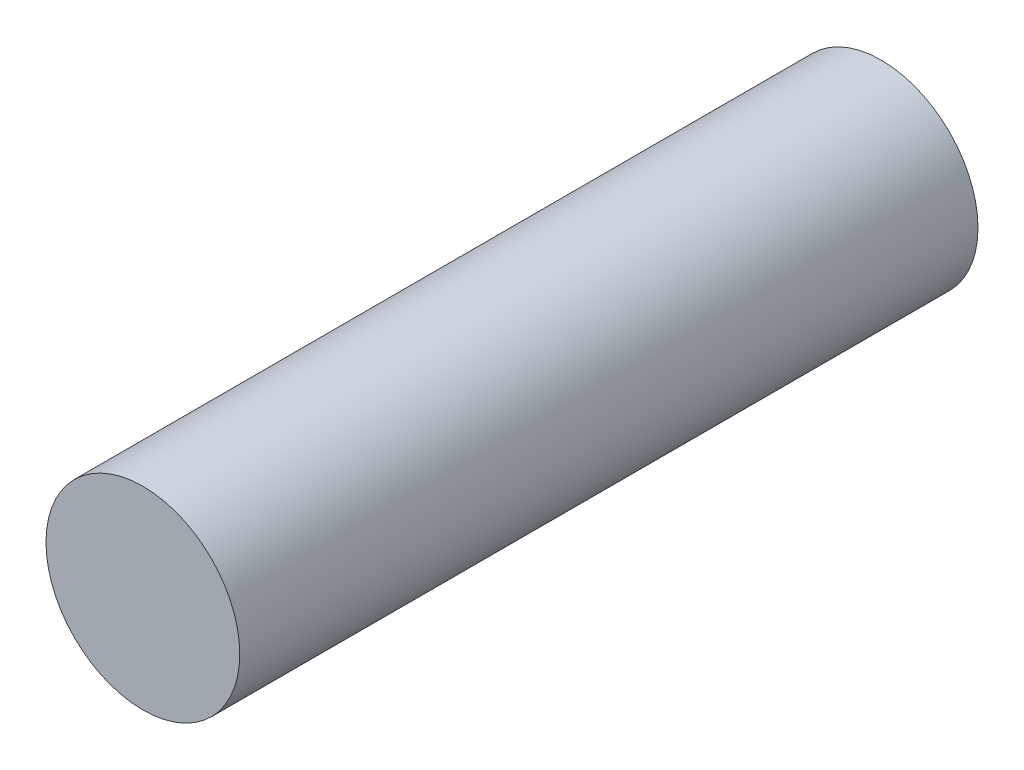
ISO-10303-21;
HEADER;
FILE_DESCRIPTION(('STEP AP214'),'2;1');
FILE_NAME('part.step','',(''),(''),'','','');
FILE_SCHEMA(('AUTOMOTIVE_DESIGN { 1 0 10303 214 1 1 1 1 }'));
ENDSEC;
DATA;
#1=APPLICATION_CONTEXT('core data for automotive mechanical design processes');
#2=APPLICATION_PROTOCOL_DEFINITION('international standard','automotive_design',2000,#1);
#3=PRODUCT_CONTEXT('',#1,'mechanical');
#4=PRODUCT('Part','Part','',(#3));
#5=PRODUCT_RELATED_PRODUCT_CATEGORY('part','',(#4));
#6=PRODUCT_DEFINITION_FORMATION('','',#4);
#7=PRODUCT_DEFINITION_CONTEXT('part definition',#1,'design');
#8=PRODUCT_DEFINITION('design','',#6,#7);
#9=PRODUCT_DEFINITION_SHAPE('','',#8);
#10=(LENGTH_UNIT() NAMED_UNIT(*) SI_UNIT(.MILLI.,.METRE.));
#11=(NAMED_UNIT(*) PLANE_ANGLE_UNIT() SI_UNIT($,.RADIAN.));
#12=(NAMED_UNIT(*) SI_UNIT($,.STERADIAN.) SOLID_ANGLE_UNIT());
#13=UNCERTAINTY_MEASURE_WITH_UNIT(LENGTH_MEASURE(1.E-05),#10,'distance_accuracy_value','');
#14=(GEOMETRIC_REPRESENTATION_CONTEXT(3) GLOBAL_UNCERTAINTY_ASSIGNED_CONTEXT((#13)) GLOBAL_UNIT_ASSIGNED_CONTEXT((#10,
#11,#12)) REPRESENTATION_CONTEXT('',''));
#15=CARTESIAN_POINT('',(0.,0.,0.));
#16=DIRECTION('',(0.,0.,1.));
#17=DIRECTION('',(1.,0.,0.));
#18=AXIS2_PLACEMENT_3D('',#15,#16,#17);
#19=CARTESIAN_POINT('',(0.,0.,38.1));
#20=DIRECTION('',(0.,0.,-1.));
#21=DIRECTION('',(-1.,0.,0.));
#22=AXIS2_PLACEMENT_3D('',#19,#20,#21);
#23=CYLINDRICAL_SURFACE('',#22,5.);
#24=CARTESIAN_POINT('',(0.,0.,38.1));
#25=DIRECTION('',(0.,0.,1.));
#26=DIRECTION('',(1.,0.,0.));
#27=AXIS2_PLACEMENT_3D('',#24,#25,#26);
#28=CIRCLE('',#27,5.);
#29=CARTESIAN_POINT('',(-5.,0.,38.1));
#30=VERTEX_POINT('',#29);
#31=EDGE_CURVE('E10',#30,#30,#28,.T.);
#32=CARTESIAN_POINT('',(0.,0.,0.));
#33=DIRECTION('',(0.,0.,1.));
#34=DIRECTION('',(1.,0.,0.));
#35=AXIS2_PLACEMENT_3D('',#32,#33,#34);
#36=CIRCLE('',#35,5.);
#37=CARTESIAN_POINT('',(-5.,0.,0.));
#38=VERTEX_POINT('',#37);
#39=EDGE_CURVE('E34',#38,#38,#36,.T.);
#40=CARTESIAN_POINT('',(-5.,0.,38.1));
#41=CARTESIAN_POINT('',(-5.,0.,37.703125));
#42=CARTESIAN_POINT('',(-5.,0.,37.30625));
#43=CARTESIAN_POINT('',(-5.,0.,36.5125));
#44=CARTESIAN_POINT('',(-5.,0.,36.115625));
#45=CARTESIAN_POINT('',(-5.,0.,35.321875));
#46=CARTESIAN_POINT('',(-5.,0.,34.925));
#47=CARTESIAN_POINT('',(-5.,0.,34.13125));
#48=CARTESIAN_POINT('',(-5.,0.,33.734375));
#49=CARTESIAN_POINT('',(-5.,0.,32.940625));
#50=CARTESIAN_POINT('',(-5.,0.,32.54375));
#51=CARTESIAN_POINT('',(-5.,0.,31.75));
#52=CARTESIAN_POINT('',(-5.,0.,31.353125));
#53=CARTESIAN_POINT('',(-5.,0.,30.559375));
#54=CARTESIAN_POINT('',(-5.,0.,30.1625));
#55=CARTESIAN_POINT('',(-5.,0.,29.36875));
#56=CARTESIAN_POINT('',(-5.,0.,28.971875));
#57=CARTESIAN_POINT('',(-5.,0.,28.178125));
#58=CARTESIAN_POINT('',(-5.,0.,27.78125));
#59=CARTESIAN_POINT('',(-5.,0.,26.9875));
#60=CARTESIAN_POINT('',(-5.,0.,26.590625));
#61=CARTESIAN_POINT('',(-5.,0.,25.796875));
#62=CARTESIAN_POINT('',(-5.,0.,25.4));
#63=CARTESIAN_POINT('',(-5.,0.,24.60625));
#64=CARTESIAN_POINT('',(-5.,0.,24.209375));
#65=CARTESIAN_POINT('',(-5.,0.,23.415625));
#66=CARTESIAN_POINT('',(-5.,0.,23.01875));
#67=CARTESIAN_POINT('',(-5.,0.,22.225));
#68=CARTESIAN_POINT('',(-5.,0.,21.828125));
#69=CARTESIAN_POINT('',(-5.,0.,21.034375));
#70=CARTESIAN_POINT('',(-5.,0.,20.6375));
#71=CARTESIAN_POINT('',(-5.,0.,19.84375));
#72=CARTESIAN_POINT('',(-5.,0.,19.446875));
#73=CARTESIAN_POINT('',(-5.,0.,18.653125));
#74=CARTESIAN_POINT('',(-5.,0.,18.25625));
#75=CARTESIAN_POINT('',(-5.,0.,17.4625));
#76=CARTESIAN_POINT('',(-5.,0.,17.065625));
#77=CARTESIAN_POINT('',(-5.,0.,16.271875));
#78=CARTESIAN_POINT('',(-5.,0.,15.875));
#79=CARTESIAN_POINT('',(-5.,0.,15.08125));
#80=CARTESIAN_POINT('',(-5.,0.,14.684375));
#81=CARTESIAN_POINT('',(-5.,0.,13.890625));
#82=CARTESIAN_POINT('',(-5.,0.,13.49375));
#83=CARTESIAN_POINT('',(-5.,0.,12.7));
#84=CARTESIAN_POINT('',(-5.,0.,12.303125));
#85=CARTESIAN_POINT('',(-5.,0.,11.509375));
#86=CARTESIAN_POINT('',(-5.,0.,11.1125));
#87=CARTESIAN_POINT('',(-5.,0.,10.31875));
#88=CARTESIAN_POINT('',(-5.,0.,9.92187499999999));
#89=CARTESIAN_POINT('',(-5.,0.,9.128125));
#90=CARTESIAN_POINT('',(-5.,0.,8.73124999999999));
#91=CARTESIAN_POINT('',(-5.,0.,7.93749999999999));
#92=CARTESIAN_POINT('',(-5.,0.,7.54062499999999));
#93=CARTESIAN_POINT('',(-5.,0.,6.746875));
#94=CARTESIAN_POINT('',(-5.,0.,6.35));
#95=CARTESIAN_POINT('',(-5.,0.,5.55625));
#96=CARTESIAN_POINT('',(-5.,0.,5.159375));
#97=CARTESIAN_POINT('',(-5.,0.,4.365625));
#98=CARTESIAN_POINT('',(-5.,0.,3.96875));
#99=CARTESIAN_POINT('',(-5.,0.,3.175));
#100=CARTESIAN_POINT('',(-5.,0.,2.778125));
#101=CARTESIAN_POINT('',(-5.,0.,1.984375));
#102=CARTESIAN_POINT('',(-5.,0.,1.5875));
#103=CARTESIAN_POINT('',(-5.,0.,0.79375));
#104=CARTESIAN_POINT('',(-5.,0.,0.396875));
#105=CARTESIAN_POINT('',(-5.,0.,0.));
#106=B_SPLINE_CURVE_WITH_KNOTS('',3,(#40,#41,#42,#43,#44,#45,#46,#47,#48,#49,#50,#51,#52,#53,
#54,#55,#56,#57,#58,#59,#60,#61,#62,#63,#64,#65,#66,#67,#68,#69,#70,#71,#72,#73,#74,#75,#76,#77,
#78,#79,#80,#81,#82,#83,#84,#85,#86,#87,#88,#89,#90,#91,#92,#93,#94,#95,#96,#97,#98,#99,#100,
#101,#102,#103,#104,#105),.UNSPECIFIED.,.F.,.F.,(4,2,2,2,2,2,2,2,2,2,2,2,2,2,2,2,2,2,2,2,2,2,2,
2,2,2,2,2,2,2,2,2,4),(0.,1.190625,2.38125,3.571875,4.7625,5.953125,7.14375,8.334375,
9.52500000000001,10.715625,11.90625,13.096875,14.2875,15.478125,16.66875,17.859375,19.05,
20.240625,21.43125,22.621875,23.8125,25.003125,26.19375,27.384375,28.575,29.765625,30.95625,
32.146875,33.3375,34.528125,35.71875,36.909375,38.1),.UNSPECIFIED.);
#107=EDGE_CURVE('BSEAM31',#30,#38,#106,.T.);
#108=ORIENTED_EDGE('',*,*,#31,.F.);
#109=ORIENTED_EDGE('',*,*,#39,.T.);
#110=ORIENTED_EDGE('',*,*,#107,.T.);
#111=ORIENTED_EDGE('',*,*,#107,.F.);
#112=EDGE_LOOP('',(#108,#110,#109,#111));
#113=FACE_BOUND('',#112,.T.);
#114=ADVANCED_FACE('F31',(#113),#23,.T.);
#115=CARTESIAN_POINT('',(0.,0.,38.1));
#116=DIRECTION('',(0.,0.,1.));
#117=DIRECTION('',(1.,0.,0.));
#118=AXIS2_PLACEMENT_3D('',#115,#116,#117);
#119=PLANE('',#118);
#120=ORIENTED_EDGE('',*,*,#31,.T.);
#121=EDGE_LOOP('',(#120));
#122=FACE_BOUND('',#121,.T.);
#123=ADVANCED_FACE('F46',(#122),#119,.T.);
#124=CARTESIAN_POINT('',(0.,0.,0.));
#125=DIRECTION('',(0.,0.,1.));
#126=DIRECTION('',(1.,0.,0.));
#127=AXIS2_PLACEMENT_3D('',#124,#125,#126);
#128=PLANE('',#127);
#129=ORIENTED_EDGE('',*,*,#39,.F.);
#130=EDGE_LOOP('',(#129));
#131=FACE_BOUND('',#130,.T.);
#132=ADVANCED_FACE('F44',(#131),#128,.F.);
#133=CLOSED_SHELL('',(#114,#123,#132));
#134=MANIFOLD_SOLID_BREP('B2',#133);
#135=ADVANCED_BREP_SHAPE_REPRESENTATION('',(#18,#134),#14);
#136=SHAPE_DEFINITION_REPRESENTATION(#9,#135);
ENDSEC;
END-ISO-10303-21;
